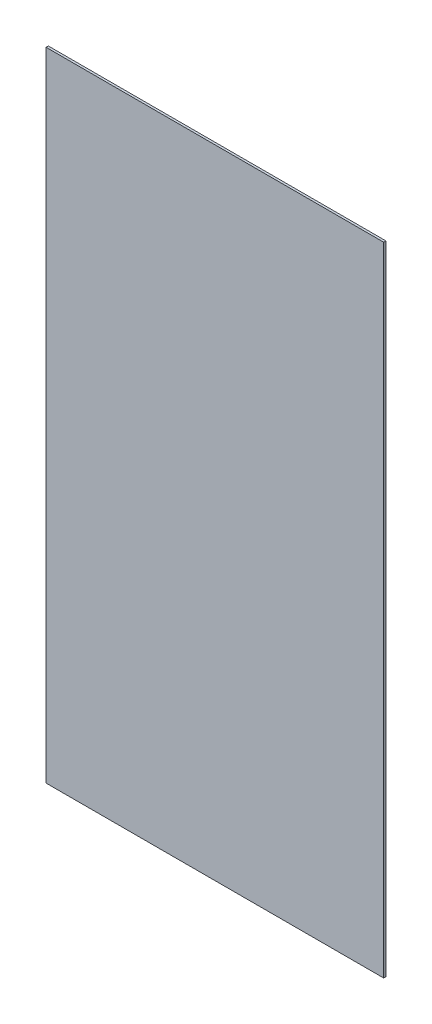
ISO-10303-21;
HEADER;
FILE_DESCRIPTION(('STEP AP214'),'2;1');
FILE_NAME('part.step','',(''),(''),'','','');
FILE_SCHEMA(('AUTOMOTIVE_DESIGN { 1 0 10303 214 1 1 1 1 }'));
ENDSEC;
DATA;
#1=APPLICATION_CONTEXT('core data for automotive mechanical design processes');
#2=APPLICATION_PROTOCOL_DEFINITION('international standard','automotive_design',2000,#1);
#3=PRODUCT_CONTEXT('',#1,'mechanical');
#4=PRODUCT('Part','Part','',(#3));
#5=PRODUCT_RELATED_PRODUCT_CATEGORY('part','',(#4));
#6=PRODUCT_DEFINITION_FORMATION('','',#4);
#7=PRODUCT_DEFINITION_CONTEXT('part definition',#1,'design');
#8=PRODUCT_DEFINITION('design','',#6,#7);
#9=PRODUCT_DEFINITION_SHAPE('','',#8);
#10=(LENGTH_UNIT() NAMED_UNIT(*) SI_UNIT(.MILLI.,.METRE.));
#11=(NAMED_UNIT(*) PLANE_ANGLE_UNIT() SI_UNIT($,.RADIAN.));
#12=(NAMED_UNIT(*) SI_UNIT($,.STERADIAN.) SOLID_ANGLE_UNIT());
#13=UNCERTAINTY_MEASURE_WITH_UNIT(LENGTH_MEASURE(1.E-05),#10,'distance_accuracy_value','');
#14=(GEOMETRIC_REPRESENTATION_CONTEXT(3) GLOBAL_UNCERTAINTY_ASSIGNED_CONTEXT((#13)) GLOBAL_UNIT_ASSIGNED_CONTEXT((#10,
#11,#12)) REPRESENTATION_CONTEXT('',''));
#15=CARTESIAN_POINT('',(0.,0.,0.));
#16=DIRECTION('',(0.,0.,1.));
#17=DIRECTION('',(1.,0.,0.));
#18=AXIS2_PLACEMENT_3D('',#15,#16,#17);
#19=CARTESIAN_POINT('',(-89.5000000000001,9.50000000000003,1.2));
#20=DIRECTION('',(1.,0.,0.));
#21=DIRECTION('',(0.,1.,0.));
#22=AXIS2_PLACEMENT_3D('',#19,#20,#21);
#23=PLANE('',#22);
#24=DIRECTION('',(0.,-1.,0.));
#25=VECTOR('',#24,1.);
#26=CARTESIAN_POINT('',(-89.5000000000001,9.50000000000003,0.));
#27=LINE('',#26,#25);
#28=CARTESIAN_POINT('',(-89.5000000000001,9.50000000000003,0.));
#29=VERTEX_POINT('',#28);
#30=CARTESIAN_POINT('',(-89.5000000000001,-328.5,0.));
#31=VERTEX_POINT('',#30);
#32=EDGE_CURVE('E100',#29,#31,#27,.T.);
#33=ORIENTED_EDGE('',*,*,#32,.T.);
#34=DIRECTION('',(0.,0.,-1.));
#35=VECTOR('',#34,1.);
#36=CARTESIAN_POINT('',(-89.5000000000001,-328.5,1.2));
#37=LINE('',#36,#35);
#38=CARTESIAN_POINT('',(-89.5000000000001,-328.5,1.2));
#39=VERTEX_POINT('',#38);
#40=EDGE_CURVE('E11',#39,#31,#37,.T.);
#41=ORIENTED_EDGE('',*,*,#40,.F.);
#42=DIRECTION('',(0.,-1.,0.));
#43=VECTOR('',#42,1.);
#44=CARTESIAN_POINT('',(-89.5000000000001,9.50000000000003,1.2));
#45=LINE('',#44,#43);
#46=CARTESIAN_POINT('',(-89.5000000000001,9.50000000000003,1.2));
#47=VERTEX_POINT('',#46);
#48=EDGE_CURVE('E88',#47,#39,#45,.T.);
#49=ORIENTED_EDGE('',*,*,#48,.F.);
#50=DIRECTION('',(0.,0.,-1.));
#51=VECTOR('',#50,1.);
#52=CARTESIAN_POINT('',(-89.5000000000001,9.50000000000003,1.2));
#53=LINE('',#52,#51);
#54=EDGE_CURVE('E96',#47,#29,#53,.T.);
#55=ORIENTED_EDGE('',*,*,#54,.T.);
#56=EDGE_LOOP('',(#33,#41,#49,#55));
#57=FACE_BOUND('',#56,.T.);
#58=ADVANCED_FACE('F37',(#57),#23,.F.);
#59=CARTESIAN_POINT('',(-89.5000000000001,-328.5,1.2));
#60=DIRECTION('',(0.,1.,0.));
#61=DIRECTION('',(0.,0.,1.));
#62=AXIS2_PLACEMENT_3D('',#59,#60,#61);
#63=PLANE('',#62);
#64=DIRECTION('',(1.,0.,0.));
#65=VECTOR('',#64,1.);
#66=CARTESIAN_POINT('',(-89.5000000000001,-328.5,0.));
#67=LINE('',#66,#65);
#68=CARTESIAN_POINT('',(89.5,-328.5,0.));
#69=VERTEX_POINT('',#68);
#70=EDGE_CURVE('E92',#31,#69,#67,.T.);
#71=ORIENTED_EDGE('',*,*,#70,.T.);
#72=DIRECTION('',(0.,0.,-1.));
#73=VECTOR('',#72,1.);
#74=CARTESIAN_POINT('',(89.5,-328.5,1.2));
#75=LINE('',#74,#73);
#76=CARTESIAN_POINT('',(89.5,-328.5,1.2));
#77=VERTEX_POINT('',#76);
#78=EDGE_CURVE('E45',#77,#69,#75,.T.);
#79=ORIENTED_EDGE('',*,*,#78,.F.);
#80=DIRECTION('',(1.,0.,0.));
#81=VECTOR('',#80,1.);
#82=CARTESIAN_POINT('',(-89.5000000000001,-328.5,1.2));
#83=LINE('',#82,#81);
#84=EDGE_CURVE('E83',#39,#77,#83,.T.);
#85=ORIENTED_EDGE('',*,*,#84,.F.);
#86=ORIENTED_EDGE('',*,*,#40,.T.);
#87=EDGE_LOOP('',(#71,#79,#85,#86));
#88=FACE_BOUND('',#87,.T.);
#89=ADVANCED_FACE('F91',(#88),#63,.F.);
#90=CARTESIAN_POINT('',(89.5,9.50000000000003,1.2));
#91=DIRECTION('',(-1.,0.,0.));
#92=DIRECTION('',(0.,-1.,0.));
#93=AXIS2_PLACEMENT_3D('',#90,#91,#92);
#94=PLANE('',#93);
#95=DIRECTION('',(0.,1.,0.));
#96=VECTOR('',#95,1.);
#97=CARTESIAN_POINT('',(89.5,9.50000000000003,0.));
#98=LINE('',#97,#96);
#99=CARTESIAN_POINT('',(89.5,9.50000000000003,0.));
#100=VERTEX_POINT('',#99);
#101=EDGE_CURVE('E70',#69,#100,#98,.T.);
#102=ORIENTED_EDGE('',*,*,#101,.T.);
#103=DIRECTION('',(0.,0.,-1.));
#104=VECTOR('',#103,1.);
#105=CARTESIAN_POINT('',(89.5,9.50000000000003,1.2));
#106=LINE('',#105,#104);
#107=CARTESIAN_POINT('',(89.5,9.50000000000003,1.2));
#108=VERTEX_POINT('',#107);
#109=EDGE_CURVE('E93',#108,#100,#106,.T.);
#110=ORIENTED_EDGE('',*,*,#109,.F.);
#111=DIRECTION('',(0.,1.,0.));
#112=VECTOR('',#111,1.);
#113=CARTESIAN_POINT('',(89.5,9.50000000000003,1.2));
#114=LINE('',#113,#112);
#115=EDGE_CURVE('E86',#77,#108,#114,.T.);
#116=ORIENTED_EDGE('',*,*,#115,.F.);
#117=ORIENTED_EDGE('',*,*,#78,.T.);
#118=EDGE_LOOP('',(#102,#110,#116,#117));
#119=FACE_BOUND('',#118,.T.);
#120=ADVANCED_FACE('F94',(#119),#94,.F.);
#121=CARTESIAN_POINT('',(-89.5000000000001,9.50000000000003,1.2));
#122=DIRECTION('',(0.,-1.,0.));
#123=DIRECTION('',(0.,0.,-1.));
#124=AXIS2_PLACEMENT_3D('',#121,#122,#123);
#125=PLANE('',#124);
#126=DIRECTION('',(-1.,0.,0.));
#127=VECTOR('',#126,1.);
#128=CARTESIAN_POINT('',(-89.5000000000001,9.50000000000003,0.));
#129=LINE('',#128,#127);
#130=EDGE_CURVE('E76',#100,#29,#129,.T.);
#131=ORIENTED_EDGE('',*,*,#130,.T.);
#132=ORIENTED_EDGE('',*,*,#54,.F.);
#133=DIRECTION('',(-1.,0.,0.));
#134=VECTOR('',#133,1.);
#135=CARTESIAN_POINT('',(-89.5000000000001,9.50000000000003,1.2));
#136=LINE('',#135,#134);
#137=EDGE_CURVE('E53',#108,#47,#136,.T.);
#138=ORIENTED_EDGE('',*,*,#137,.F.);
#139=ORIENTED_EDGE('',*,*,#109,.T.);
#140=EDGE_LOOP('',(#131,#132,#138,#139));
#141=FACE_BOUND('',#140,.T.);
#142=ADVANCED_FACE('F107',(#141),#125,.F.);
#143=CARTESIAN_POINT('',(0.,0.,1.2));
#144=DIRECTION('',(0.,0.,1.));
#145=DIRECTION('',(1.,0.,0.));
#146=AXIS2_PLACEMENT_3D('',#143,#144,#145);
#147=PLANE('',#146);
#148=ORIENTED_EDGE('',*,*,#48,.T.);
#149=ORIENTED_EDGE('',*,*,#84,.T.);
#150=ORIENTED_EDGE('',*,*,#115,.T.);
#151=ORIENTED_EDGE('',*,*,#137,.T.);
#152=EDGE_LOOP('',(#148,#149,#150,#151));
#153=FACE_BOUND('',#152,.T.);
#154=ADVANCED_FACE('F84',(#153),#147,.T.);
#155=CARTESIAN_POINT('',(0.,0.,0.));
#156=DIRECTION('',(0.,0.,1.));
#157=DIRECTION('',(1.,0.,0.));
#158=AXIS2_PLACEMENT_3D('',#155,#156,#157);
#159=PLANE('',#158);
#160=ORIENTED_EDGE('',*,*,#32,.F.);
#161=ORIENTED_EDGE('',*,*,#130,.F.);
#162=ORIENTED_EDGE('',*,*,#101,.F.);
#163=ORIENTED_EDGE('',*,*,#70,.F.);
#164=EDGE_LOOP('',(#160,#161,#162,#163));
#165=FACE_BOUND('',#164,.T.);
#166=ADVANCED_FACE('F110',(#165),#159,.F.);
#167=CLOSED_SHELL('',(#58,#89,#120,#142,#154,#166));
#168=MANIFOLD_SOLID_BREP('B2',#167);
#169=ADVANCED_BREP_SHAPE_REPRESENTATION('',(#18,#168),#14);
#170=SHAPE_DEFINITION_REPRESENTATION(#9,#169);
ENDSEC;
END-ISO-10303-21;
